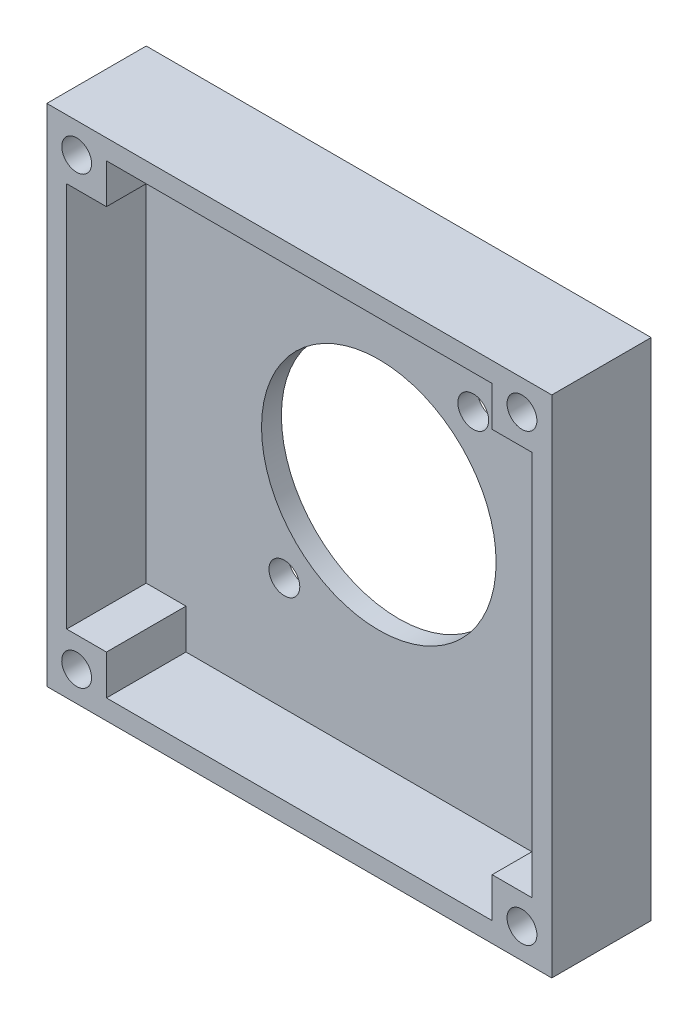
ISO-10303-21;
HEADER;
FILE_DESCRIPTION(('STEP AP214'),'2;1');
FILE_NAME('part.step','',(''),(''),'','','');
FILE_SCHEMA(('AUTOMOTIVE_DESIGN { 1 0 10303 214 1 1 1 1 }'));
ENDSEC;
DATA;
#1=APPLICATION_CONTEXT('core data for automotive mechanical design processes');
#2=APPLICATION_PROTOCOL_DEFINITION('international standard','automotive_design',2000,#1);
#3=PRODUCT_CONTEXT('',#1,'mechanical');
#4=PRODUCT('Part','Part','',(#3));
#5=PRODUCT_RELATED_PRODUCT_CATEGORY('part','',(#4));
#6=PRODUCT_DEFINITION_FORMATION('','',#4);
#7=PRODUCT_DEFINITION_CONTEXT('part definition',#1,'design');
#8=PRODUCT_DEFINITION('design','',#6,#7);
#9=PRODUCT_DEFINITION_SHAPE('','',#8);
#10=(LENGTH_UNIT() NAMED_UNIT(*) SI_UNIT(.MILLI.,.METRE.));
#11=(NAMED_UNIT(*) PLANE_ANGLE_UNIT() SI_UNIT($,.RADIAN.));
#12=(NAMED_UNIT(*) SI_UNIT($,.STERADIAN.) SOLID_ANGLE_UNIT());
#13=UNCERTAINTY_MEASURE_WITH_UNIT(LENGTH_MEASURE(1.E-05),#10,'distance_accuracy_value','');
#14=(GEOMETRIC_REPRESENTATION_CONTEXT(3) GLOBAL_UNCERTAINTY_ASSIGNED_CONTEXT((#13)) GLOBAL_UNIT_ASSIGNED_CONTEXT((#10,
#11,#12)) REPRESENTATION_CONTEXT('',''));
#15=CARTESIAN_POINT('',(0.,0.,0.));
#16=DIRECTION('',(0.,0.,1.));
#17=DIRECTION('',(1.,0.,0.));
#18=AXIS2_PLACEMENT_3D('',#15,#16,#17);
#19=CARTESIAN_POINT('',(0.,0.,2.));
#20=DIRECTION('',(0.,0.,-1.));
#21=DIRECTION('',(-1.,0.,0.));
#22=AXIS2_PLACEMENT_3D('',#19,#20,#21);
#23=PLANE('',#22);
#24=DIRECTION('',(1.,0.,0.));
#25=VECTOR('',#24,1.);
#26=CARTESIAN_POINT('',(0.,23.4,2.));
#27=LINE('',#26,#25);
#28=CARTESIAN_POINT('',(-19.4,23.4,2.));
#29=VERTEX_POINT('',#28);
#30=CARTESIAN_POINT('',(19.4,23.4,2.));
#31=VERTEX_POINT('',#30);
#32=EDGE_CURVE('E668',#29,#31,#27,.T.);
#33=ORIENTED_EDGE('',*,*,#32,.F.);
#34=DIRECTION('',(0.,-1.,0.));
#35=VECTOR('',#34,1.);
#36=CARTESIAN_POINT('',(-19.4,0.,2.));
#37=LINE('',#36,#35);
#38=CARTESIAN_POINT('',(-19.4,19.4,2.));
#39=VERTEX_POINT('',#38);
#40=EDGE_CURVE('E671',#29,#39,#37,.T.);
#41=ORIENTED_EDGE('',*,*,#40,.T.);
#42=DIRECTION('',(1.,0.,0.));
#43=VECTOR('',#42,1.);
#44=CARTESIAN_POINT('',(0.,19.4,2.));
#45=LINE('',#44,#43);
#46=CARTESIAN_POINT('',(-23.4,19.4,2.));
#47=VERTEX_POINT('',#46);
#48=EDGE_CURVE('E639',#47,#39,#45,.T.);
#49=ORIENTED_EDGE('',*,*,#48,.F.);
#50=DIRECTION('',(0.,1.,0.));
#51=VECTOR('',#50,1.);
#52=CARTESIAN_POINT('',(-23.4,0.,2.));
#53=LINE('',#52,#51);
#54=CARTESIAN_POINT('',(-23.4,-19.4,2.));
#55=VERTEX_POINT('',#54);
#56=EDGE_CURVE('E646',#55,#47,#53,.T.);
#57=ORIENTED_EDGE('',*,*,#56,.F.);
#58=DIRECTION('',(1.,0.,0.));
#59=VECTOR('',#58,1.);
#60=CARTESIAN_POINT('',(0.,-19.4,2.));
#61=LINE('',#60,#59);
#62=CARTESIAN_POINT('',(-19.4,-19.4,2.));
#63=VERTEX_POINT('',#62);
#64=EDGE_CURVE('E649',#55,#63,#61,.T.);
#65=ORIENTED_EDGE('',*,*,#64,.T.);
#66=DIRECTION('',(0.,1.,0.));
#67=VECTOR('',#66,1.);
#68=CARTESIAN_POINT('',(-19.4,0.,2.));
#69=LINE('',#68,#67);
#70=CARTESIAN_POINT('',(-19.4,-23.4,2.));
#71=VERTEX_POINT('',#70);
#72=EDGE_CURVE('E651',#71,#63,#69,.T.);
#73=ORIENTED_EDGE('',*,*,#72,.F.);
#74=DIRECTION('',(1.,0.,0.));
#75=VECTOR('',#74,1.);
#76=CARTESIAN_POINT('',(0.,-23.4,2.));
#77=LINE('',#76,#75);
#78=CARTESIAN_POINT('',(19.4,-23.4,2.));
#79=VERTEX_POINT('',#78);
#80=EDGE_CURVE('E654',#71,#79,#77,.T.);
#81=ORIENTED_EDGE('',*,*,#80,.T.);
#82=DIRECTION('',(0.,1.,0.));
#83=VECTOR('',#82,1.);
#84=CARTESIAN_POINT('',(19.4,0.,2.));
#85=LINE('',#84,#83);
#86=CARTESIAN_POINT('',(19.4,-19.4,2.));
#87=VERTEX_POINT('',#86);
#88=EDGE_CURVE('E656',#79,#87,#85,.T.);
#89=ORIENTED_EDGE('',*,*,#88,.T.);
#90=DIRECTION('',(-1.,0.,0.));
#91=VECTOR('',#90,1.);
#92=CARTESIAN_POINT('',(0.,-19.4,2.));
#93=LINE('',#92,#91);
#94=CARTESIAN_POINT('',(23.4,-19.4,2.));
#95=VERTEX_POINT('',#94);
#96=EDGE_CURVE('E658',#95,#87,#93,.T.);
#97=ORIENTED_EDGE('',*,*,#96,.F.);
#98=DIRECTION('',(0.,1.,0.));
#99=VECTOR('',#98,1.);
#100=CARTESIAN_POINT('',(23.4,0.,2.));
#101=LINE('',#100,#99);
#102=CARTESIAN_POINT('',(23.4,19.4,2.));
#103=VERTEX_POINT('',#102);
#104=EDGE_CURVE('E661',#95,#103,#101,.T.);
#105=ORIENTED_EDGE('',*,*,#104,.T.);
#106=DIRECTION('',(-1.,0.,0.));
#107=VECTOR('',#106,1.);
#108=CARTESIAN_POINT('',(0.,19.4,2.));
#109=LINE('',#108,#107);
#110=CARTESIAN_POINT('',(19.4,19.4,2.));
#111=VERTEX_POINT('',#110);
#112=EDGE_CURVE('E663',#103,#111,#109,.T.);
#113=ORIENTED_EDGE('',*,*,#112,.T.);
#114=DIRECTION('',(0.,-1.,0.));
#115=VECTOR('',#114,1.);
#116=CARTESIAN_POINT('',(19.4,0.,2.));
#117=LINE('',#116,#115);
#118=EDGE_CURVE('E665',#31,#111,#117,.T.);
#119=ORIENTED_EDGE('',*,*,#118,.F.);
#120=EDGE_LOOP('',(#33,#41,#49,#57,#65,#73,#81,#89,#97,#105,#113,#119));
#121=FACE_BOUND('',#120,.T.);
#122=CARTESIAN_POINT('',(0.,0.,2.));
#123=DIRECTION('',(0.,0.,1.));
#124=DIRECTION('',(1.,0.,0.));
#125=AXIS2_PLACEMENT_3D('',#122,#123,#124);
#126=CIRCLE('',#125,11.8);
#127=CARTESIAN_POINT('',(11.8,0.,2.));
#128=VERTEX_POINT('',#127);
#129=EDGE_CURVE('E557',#128,#128,#126,.T.);
#130=ORIENTED_EDGE('',*,*,#129,.F.);
#131=EDGE_LOOP('',(#130));
#132=FACE_BOUND('',#131,.T.);
#133=CARTESIAN_POINT('',(-9.5,-12.,2.));
#134=DIRECTION('',(0.,0.,1.));
#135=DIRECTION('',(1.,0.,0.));
#136=AXIS2_PLACEMENT_3D('',#133,#134,#135);
#137=CIRCLE('',#136,1.55);
#138=CARTESIAN_POINT('',(-7.94999999999999,-12.,2.));
#139=VERTEX_POINT('',#138);
#140=EDGE_CURVE('E680',#139,#139,#137,.T.);
#141=ORIENTED_EDGE('',*,*,#140,.F.);
#142=EDGE_LOOP('',(#141));
#143=FACE_BOUND('',#142,.T.);
#144=CARTESIAN_POINT('',(9.5,12.,2.));
#145=DIRECTION('',(0.,0.,1.));
#146=DIRECTION('',(1.,0.,0.));
#147=AXIS2_PLACEMENT_3D('',#144,#145,#146);
#148=CIRCLE('',#147,1.55);
#149=CARTESIAN_POINT('',(11.05,12.,2.));
#150=VERTEX_POINT('',#149);
#151=EDGE_CURVE('E674',#150,#150,#148,.T.);
#152=ORIENTED_EDGE('',*,*,#151,.F.);
#153=EDGE_LOOP('',(#152));
#154=FACE_BOUND('',#153,.T.);
#155=ADVANCED_FACE('F34',(#121,#132,#143,#154),#23,.F.);
#156=CARTESIAN_POINT('',(0.,0.,0.));
#157=DIRECTION('',(0.,0.,-1.));
#158=DIRECTION('',(-1.,0.,0.));
#159=AXIS2_PLACEMENT_3D('',#156,#157,#158);
#160=PLANE('',#159);
#161=CARTESIAN_POINT('',(-22.4,-22.5292564643802,0.));
#162=DIRECTION('',(0.,0.,1.));
#163=DIRECTION('',(-1.,0.,0.));
#164=AXIS2_PLACEMENT_3D('',#161,#162,#163);
#165=CIRCLE('',#164,1.5);
#166=CARTESIAN_POINT('',(-23.9,-22.5292564643802,0.));
#167=VERTEX_POINT('',#166);
#168=EDGE_CURVE('E162',#167,#167,#165,.T.);
#169=ORIENTED_EDGE('',*,*,#168,.T.);
#170=EDGE_LOOP('',(#169));
#171=FACE_BOUND('',#170,.T.);
#172=CARTESIAN_POINT('',(22.4,-22.5292564643802,0.));
#173=DIRECTION('',(0.,0.,1.));
#174=DIRECTION('',(1.,0.,0.));
#175=AXIS2_PLACEMENT_3D('',#172,#173,#174);
#176=CIRCLE('',#175,1.5);
#177=CARTESIAN_POINT('',(23.9,-22.5292564643802,0.));
#178=VERTEX_POINT('',#177);
#179=EDGE_CURVE('E168',#178,#178,#176,.T.);
#180=ORIENTED_EDGE('',*,*,#179,.T.);
#181=EDGE_LOOP('',(#180));
#182=FACE_BOUND('',#181,.T.);
#183=CARTESIAN_POINT('',(22.4,22.4,0.));
#184=DIRECTION('',(0.,0.,1.));
#185=DIRECTION('',(-1.,0.,0.));
#186=AXIS2_PLACEMENT_3D('',#183,#184,#185);
#187=CIRCLE('',#186,1.5);
#188=CARTESIAN_POINT('',(20.9,22.4,0.));
#189=VERTEX_POINT('',#188);
#190=EDGE_CURVE('E712',#189,#189,#187,.T.);
#191=ORIENTED_EDGE('',*,*,#190,.T.);
#192=EDGE_LOOP('',(#191));
#193=FACE_BOUND('',#192,.T.);
#194=CARTESIAN_POINT('',(-22.4,22.4,0.));
#195=DIRECTION('',(0.,0.,1.));
#196=DIRECTION('',(1.,0.,0.));
#197=AXIS2_PLACEMENT_3D('',#194,#195,#196);
#198=CIRCLE('',#197,1.5);
#199=CARTESIAN_POINT('',(-20.9,22.4,0.));
#200=VERTEX_POINT('',#199);
#201=EDGE_CURVE('E707',#200,#200,#198,.T.);
#202=ORIENTED_EDGE('',*,*,#201,.T.);
#203=EDGE_LOOP('',(#202));
#204=FACE_BOUND('',#203,.T.);
#205=CARTESIAN_POINT('',(-9.5,-12.,0.));
#206=DIRECTION('',(0.,0.,1.));
#207=DIRECTION('',(1.,0.,0.));
#208=AXIS2_PLACEMENT_3D('',#205,#206,#207);
#209=CIRCLE('',#208,1.55);
#210=CARTESIAN_POINT('',(-7.94999999999999,-12.,0.));
#211=VERTEX_POINT('',#210);
#212=EDGE_CURVE('E677',#211,#211,#209,.T.);
#213=ORIENTED_EDGE('',*,*,#212,.T.);
#214=EDGE_LOOP('',(#213));
#215=FACE_BOUND('',#214,.T.);
#216=CARTESIAN_POINT('',(0.,0.,0.));
#217=DIRECTION('',(0.,0.,1.));
#218=DIRECTION('',(1.,0.,0.));
#219=AXIS2_PLACEMENT_3D('',#216,#217,#218);
#220=CIRCLE('',#219,11.8);
#221=CARTESIAN_POINT('',(11.8,0.,0.));
#222=VERTEX_POINT('',#221);
#223=EDGE_CURVE('E562',#222,#222,#220,.T.);
#224=ORIENTED_EDGE('',*,*,#223,.T.);
#225=EDGE_LOOP('',(#224));
#226=FACE_BOUND('',#225,.T.);
#227=CARTESIAN_POINT('',(9.5,12.,0.));
#228=DIRECTION('',(0.,0.,1.));
#229=DIRECTION('',(1.,0.,0.));
#230=AXIS2_PLACEMENT_3D('',#227,#228,#229);
#231=CIRCLE('',#230,1.55);
#232=CARTESIAN_POINT('',(11.05,12.,0.));
#233=VERTEX_POINT('',#232);
#234=EDGE_CURVE('E673',#233,#233,#231,.T.);
#235=ORIENTED_EDGE('',*,*,#234,.T.);
#236=EDGE_LOOP('',(#235));
#237=FACE_BOUND('',#236,.T.);
#238=DIRECTION('',(0.,1.,0.));
#239=VECTOR('',#238,1.);
#240=CARTESIAN_POINT('',(25.4,-25.4,0.));
#241=LINE('',#240,#239);
#242=CARTESIAN_POINT('',(25.4,-25.4,0.));
#243=VERTEX_POINT('',#242);
#244=CARTESIAN_POINT('',(25.4,25.4,0.));
#245=VERTEX_POINT('',#244);
#246=EDGE_CURVE('E549',#243,#245,#241,.T.);
#247=ORIENTED_EDGE('',*,*,#246,.F.);
#248=DIRECTION('',(1.,0.,0.));
#249=VECTOR('',#248,1.);
#250=CARTESIAN_POINT('',(-25.4,-25.4,0.));
#251=LINE('',#250,#249);
#252=CARTESIAN_POINT('',(-25.4,-25.4,0.));
#253=VERTEX_POINT('',#252);
#254=EDGE_CURVE('E567',#253,#243,#251,.T.);
#255=ORIENTED_EDGE('',*,*,#254,.F.);
#256=DIRECTION('',(0.,-1.,0.));
#257=VECTOR('',#256,1.);
#258=CARTESIAN_POINT('',(-25.4,-25.4,0.));
#259=LINE('',#258,#257);
#260=CARTESIAN_POINT('',(-25.4,25.4,0.));
#261=VERTEX_POINT('',#260);
#262=EDGE_CURVE('E559',#261,#253,#259,.T.);
#263=ORIENTED_EDGE('',*,*,#262,.F.);
#264=DIRECTION('',(-1.,0.,0.));
#265=VECTOR('',#264,1.);
#266=CARTESIAN_POINT('',(-25.4,25.4,0.));
#267=LINE('',#266,#265);
#268=EDGE_CURVE('E556',#245,#261,#267,.T.);
#269=ORIENTED_EDGE('',*,*,#268,.F.);
#270=EDGE_LOOP('',(#247,#255,#263,#269));
#271=FACE_BOUND('',#270,.T.);
#272=ADVANCED_FACE('F189',(#171,#182,#193,#204,#215,#226,#237,#271),#160,.T.);
#273=CARTESIAN_POINT('',(25.4,-25.4,2.));
#274=DIRECTION('',(-1.,0.,0.));
#275=DIRECTION('',(0.,0.,1.));
#276=AXIS2_PLACEMENT_3D('',#273,#274,#275);
#277=PLANE('',#276);
#278=ORIENTED_EDGE('',*,*,#246,.T.);
#279=DIRECTION('',(0.,0.,-1.));
#280=VECTOR('',#279,1.);
#281=CARTESIAN_POINT('',(25.4,25.4,2.));
#282=LINE('',#281,#280);
#283=CARTESIAN_POINT('',(25.4,25.4,10.));
#284=VERTEX_POINT('',#283);
#285=EDGE_CURVE('E38',#284,#245,#282,.T.);
#286=ORIENTED_EDGE('',*,*,#285,.F.);
#287=DIRECTION('',(0.,1.,0.));
#288=VECTOR('',#287,1.);
#289=CARTESIAN_POINT('',(25.4,0.,10.));
#290=LINE('',#289,#288);
#291=CARTESIAN_POINT('',(25.4,-25.4,10.));
#292=VERTEX_POINT('',#291);
#293=EDGE_CURVE('E593',#292,#284,#290,.T.);
#294=ORIENTED_EDGE('',*,*,#293,.F.);
#295=DIRECTION('',(0.,0.,-1.));
#296=VECTOR('',#295,1.);
#297=CARTESIAN_POINT('',(25.4,-25.4,2.));
#298=LINE('',#297,#296);
#299=EDGE_CURVE('E553',#292,#243,#298,.T.);
#300=ORIENTED_EDGE('',*,*,#299,.T.);
#301=EDGE_LOOP('',(#278,#286,#294,#300));
#302=FACE_BOUND('',#301,.T.);
#303=ADVANCED_FACE('F36',(#302),#277,.F.);
#304=CARTESIAN_POINT('',(-25.4,25.4,2.));
#305=DIRECTION('',(0.,-1.,0.));
#306=DIRECTION('',(0.,0.,-1.));
#307=AXIS2_PLACEMENT_3D('',#304,#305,#306);
#308=PLANE('',#307);
#309=ORIENTED_EDGE('',*,*,#268,.T.);
#310=DIRECTION('',(0.,0.,-1.));
#311=VECTOR('',#310,1.);
#312=CARTESIAN_POINT('',(-25.4,25.4,2.));
#313=LINE('',#312,#311);
#314=CARTESIAN_POINT('',(-25.4,25.4,10.));
#315=VERTEX_POINT('',#314);
#316=EDGE_CURVE('E572',#315,#261,#313,.T.);
#317=ORIENTED_EDGE('',*,*,#316,.F.);
#318=DIRECTION('',(1.,0.,0.));
#319=VECTOR('',#318,1.);
#320=CARTESIAN_POINT('',(0.,25.4,10.));
#321=LINE('',#320,#319);
#322=EDGE_CURVE('E578',#315,#284,#321,.T.);
#323=ORIENTED_EDGE('',*,*,#322,.T.);
#324=ORIENTED_EDGE('',*,*,#285,.T.);
#325=EDGE_LOOP('',(#309,#317,#323,#324));
#326=FACE_BOUND('',#325,.T.);
#327=ADVANCED_FACE('F429',(#326),#308,.F.);
#328=CARTESIAN_POINT('',(-25.4,-25.4,2.));
#329=DIRECTION('',(1.,0.,0.));
#330=DIRECTION('',(0.,0.,-1.));
#331=AXIS2_PLACEMENT_3D('',#328,#329,#330);
#332=PLANE('',#331);
#333=ORIENTED_EDGE('',*,*,#262,.T.);
#334=DIRECTION('',(0.,0.,-1.));
#335=VECTOR('',#334,1.);
#336=CARTESIAN_POINT('',(-25.4,-25.4,2.));
#337=LINE('',#336,#335);
#338=CARTESIAN_POINT('',(-25.4,-25.4,10.));
#339=VERTEX_POINT('',#338);
#340=EDGE_CURVE('E570',#339,#253,#337,.T.);
#341=ORIENTED_EDGE('',*,*,#340,.F.);
#342=DIRECTION('',(0.,1.,0.));
#343=VECTOR('',#342,1.);
#344=CARTESIAN_POINT('',(-25.4,0.,10.));
#345=LINE('',#344,#343);
#346=EDGE_CURVE('E581',#339,#315,#345,.T.);
#347=ORIENTED_EDGE('',*,*,#346,.T.);
#348=ORIENTED_EDGE('',*,*,#316,.T.);
#349=EDGE_LOOP('',(#333,#341,#347,#348));
#350=FACE_BOUND('',#349,.T.);
#351=ADVANCED_FACE('F421',(#350),#332,.F.);
#352=CARTESIAN_POINT('',(-25.4,-25.4,2.));
#353=DIRECTION('',(0.,1.,0.));
#354=DIRECTION('',(0.,0.,1.));
#355=AXIS2_PLACEMENT_3D('',#352,#353,#354);
#356=PLANE('',#355);
#357=ORIENTED_EDGE('',*,*,#254,.T.);
#358=ORIENTED_EDGE('',*,*,#299,.F.);
#359=DIRECTION('',(1.,0.,0.));
#360=VECTOR('',#359,1.);
#361=CARTESIAN_POINT('',(0.,-25.4,10.));
#362=LINE('',#361,#360);
#363=EDGE_CURVE('E584',#339,#292,#362,.T.);
#364=ORIENTED_EDGE('',*,*,#363,.F.);
#365=ORIENTED_EDGE('',*,*,#340,.T.);
#366=EDGE_LOOP('',(#357,#358,#364,#365));
#367=FACE_BOUND('',#366,.T.);
#368=ADVANCED_FACE('F415',(#367),#356,.F.);
#369=CARTESIAN_POINT('',(0.,0.,2.));
#370=DIRECTION('',(0.,0.,-1.));
#371=DIRECTION('',(-1.,0.,0.));
#372=AXIS2_PLACEMENT_3D('',#369,#370,#371);
#373=CYLINDRICAL_SURFACE('',#372,11.8);
#374=ORIENTED_EDGE('',*,*,#129,.T.);
#375=EDGE_LOOP('',(#374));
#376=FACE_BOUND('',#375,.T.);
#377=ORIENTED_EDGE('',*,*,#223,.F.);
#378=EDGE_LOOP('',(#377));
#379=FACE_BOUND('',#378,.T.);
#380=ADVANCED_FACE('F407',(#376,#379),#373,.F.);
#381=CARTESIAN_POINT('',(-9.5,-12.,2.));
#382=DIRECTION('',(0.,0.,-1.));
#383=DIRECTION('',(-1.,0.,0.));
#384=AXIS2_PLACEMENT_3D('',#381,#382,#383);
#385=CYLINDRICAL_SURFACE('',#384,1.55);
#386=ORIENTED_EDGE('',*,*,#140,.T.);
#387=EDGE_LOOP('',(#386));
#388=FACE_BOUND('',#387,.T.);
#389=ORIENTED_EDGE('',*,*,#212,.F.);
#390=EDGE_LOOP('',(#389));
#391=FACE_BOUND('',#390,.T.);
#392=ADVANCED_FACE('F399',(#388,#391),#385,.F.);
#393=CARTESIAN_POINT('',(9.5,12.,2.));
#394=DIRECTION('',(0.,0.,-1.));
#395=DIRECTION('',(-1.,0.,0.));
#396=AXIS2_PLACEMENT_3D('',#393,#394,#395);
#397=CYLINDRICAL_SURFACE('',#396,1.55);
#398=ORIENTED_EDGE('',*,*,#151,.T.);
#399=EDGE_LOOP('',(#398));
#400=FACE_BOUND('',#399,.T.);
#401=ORIENTED_EDGE('',*,*,#234,.F.);
#402=EDGE_LOOP('',(#401));
#403=FACE_BOUND('',#402,.T.);
#404=ADVANCED_FACE('F390',(#400,#403),#397,.F.);
#405=CARTESIAN_POINT('',(-19.4,0.,10.));
#406=DIRECTION('',(1.,0.,0.));
#407=DIRECTION('',(0.,0.,-1.));
#408=AXIS2_PLACEMENT_3D('',#405,#406,#407);
#409=PLANE('',#408);
#410=ORIENTED_EDGE('',*,*,#40,.F.);
#411=DIRECTION('',(0.,0.,-1.));
#412=VECTOR('',#411,1.);
#413=CARTESIAN_POINT('',(-19.4,23.4,10.));
#414=LINE('',#413,#412);
#415=CARTESIAN_POINT('',(-19.4,23.4,10.));
#416=VERTEX_POINT('',#415);
#417=EDGE_CURVE('E637',#416,#29,#414,.T.);
#418=ORIENTED_EDGE('',*,*,#417,.F.);
#419=DIRECTION('',(0.,-1.,0.));
#420=VECTOR('',#419,1.);
#421=CARTESIAN_POINT('',(-19.4,0.,10.));
#422=LINE('',#421,#420);
#423=CARTESIAN_POINT('',(-19.4,19.4,10.));
#424=VERTEX_POINT('',#423);
#425=EDGE_CURVE('E704',#416,#424,#422,.T.);
#426=ORIENTED_EDGE('',*,*,#425,.T.);
#427=DIRECTION('',(0.,0.,-1.));
#428=VECTOR('',#427,1.);
#429=CARTESIAN_POINT('',(-19.4,19.4,10.));
#430=LINE('',#429,#428);
#431=EDGE_CURVE('E604',#424,#39,#430,.T.);
#432=ORIENTED_EDGE('',*,*,#431,.T.);
#433=EDGE_LOOP('',(#410,#418,#426,#432));
#434=FACE_BOUND('',#433,.T.);
#435=ADVANCED_FACE('F382',(#434),#409,.T.);
#436=CARTESIAN_POINT('',(0.,23.4,10.));
#437=DIRECTION('',(0.,1.,0.));
#438=DIRECTION('',(0.,0.,1.));
#439=AXIS2_PLACEMENT_3D('',#436,#437,#438);
#440=PLANE('',#439);
#441=ORIENTED_EDGE('',*,*,#417,.T.);
#442=ORIENTED_EDGE('',*,*,#32,.T.);
#443=DIRECTION('',(0.,0.,-1.));
#444=VECTOR('',#443,1.);
#445=CARTESIAN_POINT('',(19.4,23.4,10.));
#446=LINE('',#445,#444);
#447=CARTESIAN_POINT('',(19.4,23.4,10.));
#448=VERTEX_POINT('',#447);
#449=EDGE_CURVE('E634',#448,#31,#446,.T.);
#450=ORIENTED_EDGE('',*,*,#449,.F.);
#451=DIRECTION('',(1.,0.,0.));
#452=VECTOR('',#451,1.);
#453=CARTESIAN_POINT('',(0.,23.4,10.));
#454=LINE('',#453,#452);
#455=EDGE_CURVE('E706',#416,#448,#454,.T.);
#456=ORIENTED_EDGE('',*,*,#455,.F.);
#457=EDGE_LOOP('',(#441,#442,#450,#456));
#458=FACE_BOUND('',#457,.T.);
#459=ADVANCED_FACE('F374',(#458),#440,.F.);
#460=CARTESIAN_POINT('',(19.4,0.,10.));
#461=DIRECTION('',(1.,0.,0.));
#462=DIRECTION('',(0.,0.,-1.));
#463=AXIS2_PLACEMENT_3D('',#460,#461,#462);
#464=PLANE('',#463);
#465=ORIENTED_EDGE('',*,*,#449,.T.);
#466=ORIENTED_EDGE('',*,*,#118,.T.);
#467=DIRECTION('',(0.,0.,-1.));
#468=VECTOR('',#467,1.);
#469=CARTESIAN_POINT('',(19.4,19.4,10.));
#470=LINE('',#469,#468);
#471=CARTESIAN_POINT('',(19.4,19.4,10.));
#472=VERTEX_POINT('',#471);
#473=EDGE_CURVE('E631',#472,#111,#470,.T.);
#474=ORIENTED_EDGE('',*,*,#473,.F.);
#475=DIRECTION('',(0.,-1.,0.));
#476=VECTOR('',#475,1.);
#477=CARTESIAN_POINT('',(19.4,0.,10.));
#478=LINE('',#477,#476);
#479=EDGE_CURVE('E709',#448,#472,#478,.T.);
#480=ORIENTED_EDGE('',*,*,#479,.F.);
#481=EDGE_LOOP('',(#465,#466,#474,#480));
#482=FACE_BOUND('',#481,.T.);
#483=ADVANCED_FACE('F366',(#482),#464,.F.);
#484=CARTESIAN_POINT('',(0.,19.4,10.));
#485=DIRECTION('',(0.,-1.,0.));
#486=DIRECTION('',(0.,0.,-1.));
#487=AXIS2_PLACEMENT_3D('',#484,#485,#486);
#488=PLANE('',#487);
#489=ORIENTED_EDGE('',*,*,#112,.F.);
#490=DIRECTION('',(0.,0.,-1.));
#491=VECTOR('',#490,1.);
#492=CARTESIAN_POINT('',(23.4,19.4,10.));
#493=LINE('',#492,#491);
#494=CARTESIAN_POINT('',(23.4,19.4,10.));
#495=VERTEX_POINT('',#494);
#496=EDGE_CURVE('E628',#495,#103,#493,.T.);
#497=ORIENTED_EDGE('',*,*,#496,.F.);
#498=DIRECTION('',(-1.,0.,0.));
#499=VECTOR('',#498,1.);
#500=CARTESIAN_POINT('',(0.,19.4,10.));
#501=LINE('',#500,#499);
#502=EDGE_CURVE('E717',#495,#472,#501,.T.);
#503=ORIENTED_EDGE('',*,*,#502,.T.);
#504=ORIENTED_EDGE('',*,*,#473,.T.);
#505=EDGE_LOOP('',(#489,#497,#503,#504));
#506=FACE_BOUND('',#505,.T.);
#507=ADVANCED_FACE('F358',(#506),#488,.T.);
#508=CARTESIAN_POINT('',(23.4,0.,10.));
#509=DIRECTION('',(-1.,0.,0.));
#510=DIRECTION('',(0.,0.,1.));
#511=AXIS2_PLACEMENT_3D('',#508,#509,#510);
#512=PLANE('',#511);
#513=ORIENTED_EDGE('',*,*,#104,.F.);
#514=DIRECTION('',(0.,0.,-1.));
#515=VECTOR('',#514,1.);
#516=CARTESIAN_POINT('',(23.4,-19.4,10.));
#517=LINE('',#516,#515);
#518=CARTESIAN_POINT('',(23.4,-19.4,10.));
#519=VERTEX_POINT('',#518);
#520=EDGE_CURVE('E625',#519,#95,#517,.T.);
#521=ORIENTED_EDGE('',*,*,#520,.F.);
#522=DIRECTION('',(0.,1.,0.));
#523=VECTOR('',#522,1.);
#524=CARTESIAN_POINT('',(23.4,0.,10.));
#525=LINE('',#524,#523);
#526=EDGE_CURVE('E720',#519,#495,#525,.T.);
#527=ORIENTED_EDGE('',*,*,#526,.T.);
#528=ORIENTED_EDGE('',*,*,#496,.T.);
#529=EDGE_LOOP('',(#513,#521,#527,#528));
#530=FACE_BOUND('',#529,.T.);
#531=ADVANCED_FACE('F350',(#530),#512,.T.);
#532=CARTESIAN_POINT('',(0.,-19.4,10.));
#533=DIRECTION('',(0.,-1.,0.));
#534=DIRECTION('',(0.,0.,-1.));
#535=AXIS2_PLACEMENT_3D('',#532,#533,#534);
#536=PLANE('',#535);
#537=ORIENTED_EDGE('',*,*,#520,.T.);
#538=ORIENTED_EDGE('',*,*,#96,.T.);
#539=DIRECTION('',(0.,0.,-1.));
#540=VECTOR('',#539,1.);
#541=CARTESIAN_POINT('',(19.4,-19.4,10.));
#542=LINE('',#541,#540);
#543=CARTESIAN_POINT('',(19.4,-19.4,10.));
#544=VERTEX_POINT('',#543);
#545=EDGE_CURVE('E622',#544,#87,#542,.T.);
#546=ORIENTED_EDGE('',*,*,#545,.F.);
#547=DIRECTION('',(-1.,0.,0.));
#548=VECTOR('',#547,1.);
#549=CARTESIAN_POINT('',(0.,-19.4,10.));
#550=LINE('',#549,#548);
#551=EDGE_CURVE('E723',#519,#544,#550,.T.);
#552=ORIENTED_EDGE('',*,*,#551,.F.);
#553=EDGE_LOOP('',(#537,#538,#546,#552));
#554=FACE_BOUND('',#553,.T.);
#555=ADVANCED_FACE('F342',(#554),#536,.F.);
#556=CARTESIAN_POINT('',(19.4,0.,10.));
#557=DIRECTION('',(-1.,0.,0.));
#558=DIRECTION('',(0.,0.,1.));
#559=AXIS2_PLACEMENT_3D('',#556,#557,#558);
#560=PLANE('',#559);
#561=ORIENTED_EDGE('',*,*,#88,.F.);
#562=DIRECTION('',(0.,0.,-1.));
#563=VECTOR('',#562,1.);
#564=CARTESIAN_POINT('',(19.4,-23.4,10.));
#565=LINE('',#564,#563);
#566=CARTESIAN_POINT('',(19.4,-23.4,10.));
#567=VERTEX_POINT('',#566);
#568=EDGE_CURVE('E619',#567,#79,#565,.T.);
#569=ORIENTED_EDGE('',*,*,#568,.F.);
#570=DIRECTION('',(0.,1.,0.));
#571=VECTOR('',#570,1.);
#572=CARTESIAN_POINT('',(19.4,0.,10.));
#573=LINE('',#572,#571);
#574=EDGE_CURVE('E725',#567,#544,#573,.T.);
#575=ORIENTED_EDGE('',*,*,#574,.T.);
#576=ORIENTED_EDGE('',*,*,#545,.T.);
#577=EDGE_LOOP('',(#561,#569,#575,#576));
#578=FACE_BOUND('',#577,.T.);
#579=ADVANCED_FACE('F334',(#578),#560,.T.);
#580=CARTESIAN_POINT('',(0.,-23.4,10.));
#581=DIRECTION('',(0.,1.,0.));
#582=DIRECTION('',(0.,0.,1.));
#583=AXIS2_PLACEMENT_3D('',#580,#581,#582);
#584=PLANE('',#583);
#585=ORIENTED_EDGE('',*,*,#80,.F.);
#586=DIRECTION('',(0.,0.,-1.));
#587=VECTOR('',#586,1.);
#588=CARTESIAN_POINT('',(-19.4,-23.4,10.));
#589=LINE('',#588,#587);
#590=CARTESIAN_POINT('',(-19.4,-23.4,10.));
#591=VERTEX_POINT('',#590);
#592=EDGE_CURVE('E616',#591,#71,#589,.T.);
#593=ORIENTED_EDGE('',*,*,#592,.F.);
#594=DIRECTION('',(1.,0.,0.));
#595=VECTOR('',#594,1.);
#596=CARTESIAN_POINT('',(0.,-23.4,10.));
#597=LINE('',#596,#595);
#598=EDGE_CURVE('E728',#591,#567,#597,.T.);
#599=ORIENTED_EDGE('',*,*,#598,.T.);
#600=ORIENTED_EDGE('',*,*,#568,.T.);
#601=EDGE_LOOP('',(#585,#593,#599,#600));
#602=FACE_BOUND('',#601,.T.);
#603=ADVANCED_FACE('F326',(#602),#584,.T.);
#604=CARTESIAN_POINT('',(-19.4,0.,10.));
#605=DIRECTION('',(-1.,0.,0.));
#606=DIRECTION('',(0.,0.,1.));
#607=AXIS2_PLACEMENT_3D('',#604,#605,#606);
#608=PLANE('',#607);
#609=ORIENTED_EDGE('',*,*,#592,.T.);
#610=ORIENTED_EDGE('',*,*,#72,.T.);
#611=DIRECTION('',(0.,0.,-1.));
#612=VECTOR('',#611,1.);
#613=CARTESIAN_POINT('',(-19.4,-19.4,10.));
#614=LINE('',#613,#612);
#615=CARTESIAN_POINT('',(-19.4,-19.4,10.));
#616=VERTEX_POINT('',#615);
#617=EDGE_CURVE('E613',#616,#63,#614,.T.);
#618=ORIENTED_EDGE('',*,*,#617,.F.);
#619=DIRECTION('',(0.,1.,0.));
#620=VECTOR('',#619,1.);
#621=CARTESIAN_POINT('',(-19.4,0.,10.));
#622=LINE('',#621,#620);
#623=EDGE_CURVE('E731',#591,#616,#622,.T.);
#624=ORIENTED_EDGE('',*,*,#623,.F.);
#625=EDGE_LOOP('',(#609,#610,#618,#624));
#626=FACE_BOUND('',#625,.T.);
#627=ADVANCED_FACE('F318',(#626),#608,.F.);
#628=CARTESIAN_POINT('',(0.,-19.4,10.));
#629=DIRECTION('',(0.,1.,0.));
#630=DIRECTION('',(0.,0.,1.));
#631=AXIS2_PLACEMENT_3D('',#628,#629,#630);
#632=PLANE('',#631);
#633=ORIENTED_EDGE('',*,*,#64,.F.);
#634=DIRECTION('',(0.,0.,-1.));
#635=VECTOR('',#634,1.);
#636=CARTESIAN_POINT('',(-23.4,-19.4,10.));
#637=LINE('',#636,#635);
#638=CARTESIAN_POINT('',(-23.4,-19.4,10.));
#639=VERTEX_POINT('',#638);
#640=EDGE_CURVE('E610',#639,#55,#637,.T.);
#641=ORIENTED_EDGE('',*,*,#640,.F.);
#642=DIRECTION('',(1.,0.,0.));
#643=VECTOR('',#642,1.);
#644=CARTESIAN_POINT('',(0.,-19.4,10.));
#645=LINE('',#644,#643);
#646=EDGE_CURVE('E733',#639,#616,#645,.T.);
#647=ORIENTED_EDGE('',*,*,#646,.T.);
#648=ORIENTED_EDGE('',*,*,#617,.T.);
#649=EDGE_LOOP('',(#633,#641,#647,#648));
#650=FACE_BOUND('',#649,.T.);
#651=ADVANCED_FACE('F311',(#650),#632,.T.);
#652=CARTESIAN_POINT('',(-23.4,0.,10.));
#653=DIRECTION('',(-1.,0.,0.));
#654=DIRECTION('',(0.,0.,1.));
#655=AXIS2_PLACEMENT_3D('',#652,#653,#654);
#656=PLANE('',#655);
#657=ORIENTED_EDGE('',*,*,#640,.T.);
#658=ORIENTED_EDGE('',*,*,#56,.T.);
#659=DIRECTION('',(0.,0.,-1.));
#660=VECTOR('',#659,1.);
#661=CARTESIAN_POINT('',(-23.4,19.4,10.));
#662=LINE('',#661,#660);
#663=CARTESIAN_POINT('',(-23.4,19.4,10.));
#664=VERTEX_POINT('',#663);
#665=EDGE_CURVE('E607',#664,#47,#662,.T.);
#666=ORIENTED_EDGE('',*,*,#665,.F.);
#667=DIRECTION('',(0.,1.,0.));
#668=VECTOR('',#667,1.);
#669=CARTESIAN_POINT('',(-23.4,0.,10.));
#670=LINE('',#669,#668);
#671=EDGE_CURVE('E736',#639,#664,#670,.T.);
#672=ORIENTED_EDGE('',*,*,#671,.F.);
#673=EDGE_LOOP('',(#657,#658,#666,#672));
#674=FACE_BOUND('',#673,.T.);
#675=ADVANCED_FACE('F299',(#674),#656,.F.);
#676=CARTESIAN_POINT('',(-22.4,-22.4,10.));
#677=DIRECTION('',(0.,0.,-1.));
#678=DIRECTION('',(-1.,0.,0.));
#679=AXIS2_PLACEMENT_3D('',#676,#677,#678);
#680=CYLINDRICAL_SURFACE('',#679,1.5);
#681=CARTESIAN_POINT('',(-22.4,-22.4,10.));
#682=DIRECTION('',(0.,0.,1.));
#683=DIRECTION('',(1.,0.,0.));
#684=AXIS2_PLACEMENT_3D('',#681,#682,#683);
#685=CIRCLE('',#684,1.5);
#686=CARTESIAN_POINT('',(-20.9,-22.4,10.));
#687=VERTEX_POINT('',#686);
#688=EDGE_CURVE('E598',#687,#687,#685,.T.);
#689=ORIENTED_EDGE('',*,*,#688,.T.);
#690=EDGE_LOOP('',(#689));
#691=FACE_BOUND('',#690,.T.);
#692=CARTESIAN_POINT('',(-22.4,-22.4,2.));
#693=DIRECTION('',(0.,0.,-1.));
#694=DIRECTION('',(-1.,0.,0.));
#695=AXIS2_PLACEMENT_3D('',#692,#693,#694);
#696=CIRCLE('',#695,1.5);
#697=CARTESIAN_POINT('',(-23.8986070837962,-22.4646282321901,2.));
#698=VERTEX_POINT('',#697);
#699=CARTESIAN_POINT('',(-20.9013929162039,-22.4646282321901,2.));
#700=VERTEX_POINT('',#699);
#701=EDGE_CURVE('E644',#698,#700,#696,.F.);
#702=ORIENTED_EDGE('',*,*,#701,.F.);
#703=EDGE_CURVE('E643',#700,#698,#696,.F.);
#704=ORIENTED_EDGE('',*,*,#703,.F.);
#705=EDGE_LOOP('',(#702,#704));
#706=FACE_BOUND('',#705,.T.);
#707=ADVANCED_FACE('F270',(#691,#706),#680,.F.);
#708=CARTESIAN_POINT('',(22.4,22.4,10.));
#709=DIRECTION('',(0.,0.,-1.));
#710=DIRECTION('',(-1.,0.,0.));
#711=AXIS2_PLACEMENT_3D('',#708,#709,#710);
#712=CYLINDRICAL_SURFACE('',#711,1.5);
#713=CARTESIAN_POINT('',(22.4,22.4,10.));
#714=DIRECTION('',(0.,0.,1.));
#715=DIRECTION('',(1.,0.,0.));
#716=AXIS2_PLACEMENT_3D('',#713,#714,#715);
#717=CIRCLE('',#716,1.5);
#718=CARTESIAN_POINT('',(23.9,22.4,10.));
#719=VERTEX_POINT('',#718);
#720=EDGE_CURVE('E595',#719,#719,#717,.F.);
#721=ORIENTED_EDGE('',*,*,#720,.F.);
#722=EDGE_LOOP('',(#721));
#723=FACE_BOUND('',#722,.T.);
#724=ORIENTED_EDGE('',*,*,#190,.F.);
#725=EDGE_LOOP('',(#724));
#726=FACE_BOUND('',#725,.T.);
#727=ADVANCED_FACE('F257',(#723,#726),#712,.F.);
#728=CARTESIAN_POINT('',(-22.4,22.4,10.));
#729=DIRECTION('',(0.,0.,-1.));
#730=DIRECTION('',(-1.,0.,0.));
#731=AXIS2_PLACEMENT_3D('',#728,#729,#730);
#732=CYLINDRICAL_SURFACE('',#731,1.5);
#733=CARTESIAN_POINT('',(-22.4,22.4,10.));
#734=DIRECTION('',(0.,0.,1.));
#735=DIRECTION('',(1.,0.,0.));
#736=AXIS2_PLACEMENT_3D('',#733,#734,#735);
#737=CIRCLE('',#736,1.5);
#738=CARTESIAN_POINT('',(-20.9,22.4,10.));
#739=VERTEX_POINT('',#738);
#740=EDGE_CURVE('E582',#739,#739,#737,.T.);
#741=ORIENTED_EDGE('',*,*,#740,.T.);
#742=EDGE_LOOP('',(#741));
#743=FACE_BOUND('',#742,.T.);
#744=ORIENTED_EDGE('',*,*,#201,.F.);
#745=EDGE_LOOP('',(#744));
#746=FACE_BOUND('',#745,.T.);
#747=ADVANCED_FACE('F183',(#743,#746),#732,.F.);
#748=CARTESIAN_POINT('',(0.,19.4,10.));
#749=DIRECTION('',(0.,1.,0.));
#750=DIRECTION('',(0.,0.,1.));
#751=AXIS2_PLACEMENT_3D('',#748,#749,#750);
#752=PLANE('',#751);
#753=ORIENTED_EDGE('',*,*,#665,.T.);
#754=ORIENTED_EDGE('',*,*,#48,.T.);
#755=ORIENTED_EDGE('',*,*,#431,.F.);
#756=DIRECTION('',(1.,0.,0.));
#757=VECTOR('',#756,1.);
#758=CARTESIAN_POINT('',(0.,19.4,10.));
#759=LINE('',#758,#757);
#760=EDGE_CURVE('E587',#664,#424,#759,.T.);
#761=ORIENTED_EDGE('',*,*,#760,.F.);
#762=EDGE_LOOP('',(#753,#754,#755,#761));
#763=FACE_BOUND('',#762,.T.);
#764=ADVANCED_FACE('F174',(#763),#752,.F.);
#765=CARTESIAN_POINT('',(22.4,-22.4,10.));
#766=DIRECTION('',(0.,0.,-1.));
#767=DIRECTION('',(-1.,0.,0.));
#768=AXIS2_PLACEMENT_3D('',#765,#766,#767);
#769=CYLINDRICAL_SURFACE('',#768,1.5);
#770=CARTESIAN_POINT('',(22.4,-22.4,10.));
#771=DIRECTION('',(0.,0.,1.));
#772=DIRECTION('',(1.,0.,0.));
#773=AXIS2_PLACEMENT_3D('',#770,#771,#772);
#774=CIRCLE('',#773,1.5);
#775=CARTESIAN_POINT('',(23.9,-22.4,10.));
#776=VERTEX_POINT('',#775);
#777=EDGE_CURVE('E601',#776,#776,#774,.F.);
#778=ORIENTED_EDGE('',*,*,#777,.F.);
#779=EDGE_LOOP('',(#778));
#780=FACE_BOUND('',#779,.T.);
#781=CARTESIAN_POINT('',(22.4,-22.4,2.));
#782=DIRECTION('',(0.,0.,-1.));
#783=DIRECTION('',(-1.,0.,0.));
#784=AXIS2_PLACEMENT_3D('',#781,#782,#783);
#785=CIRCLE('',#784,1.5);
#786=CARTESIAN_POINT('',(23.8986070837961,-22.46462823219,2.));
#787=VERTEX_POINT('',#786);
#788=CARTESIAN_POINT('',(20.9013929162039,-22.4646282321903,2.));
#789=VERTEX_POINT('',#788);
#790=EDGE_CURVE('E11',#787,#789,#785,.T.);
#791=ORIENTED_EDGE('',*,*,#790,.T.);
#792=EDGE_CURVE('E43',#789,#787,#785,.T.);
#793=ORIENTED_EDGE('',*,*,#792,.T.);
#794=EDGE_LOOP('',(#791,#793));
#795=FACE_BOUND('',#794,.T.);
#796=ADVANCED_FACE('F171',(#780,#795),#769,.F.);
#797=CARTESIAN_POINT('',(0.,0.,10.));
#798=DIRECTION('',(0.,0.,1.));
#799=DIRECTION('',(1.,0.,0.));
#800=AXIS2_PLACEMENT_3D('',#797,#798,#799);
#801=PLANE('',#800);
#802=ORIENTED_EDGE('',*,*,#425,.F.);
#803=ORIENTED_EDGE('',*,*,#455,.T.);
#804=ORIENTED_EDGE('',*,*,#479,.T.);
#805=ORIENTED_EDGE('',*,*,#502,.F.);
#806=ORIENTED_EDGE('',*,*,#526,.F.);
#807=ORIENTED_EDGE('',*,*,#551,.T.);
#808=ORIENTED_EDGE('',*,*,#574,.F.);
#809=ORIENTED_EDGE('',*,*,#598,.F.);
#810=ORIENTED_EDGE('',*,*,#623,.T.);
#811=ORIENTED_EDGE('',*,*,#646,.F.);
#812=ORIENTED_EDGE('',*,*,#671,.T.);
#813=ORIENTED_EDGE('',*,*,#760,.T.);
#814=EDGE_LOOP('',(#802,#803,#804,#805,#806,#807,#808,#809,#810,#811,#812,#813));
#815=FACE_BOUND('',#814,.T.);
#816=ORIENTED_EDGE('',*,*,#740,.F.);
#817=EDGE_LOOP('',(#816));
#818=FACE_BOUND('',#817,.T.);
#819=ORIENTED_EDGE('',*,*,#322,.F.);
#820=ORIENTED_EDGE('',*,*,#346,.F.);
#821=ORIENTED_EDGE('',*,*,#363,.T.);
#822=ORIENTED_EDGE('',*,*,#293,.T.);
#823=EDGE_LOOP('',(#819,#820,#821,#822));
#824=FACE_BOUND('',#823,.T.);
#825=ORIENTED_EDGE('',*,*,#720,.T.);
#826=EDGE_LOOP('',(#825));
#827=FACE_BOUND('',#826,.T.);
#828=ORIENTED_EDGE('',*,*,#688,.F.);
#829=EDGE_LOOP('',(#828));
#830=FACE_BOUND('',#829,.T.);
#831=ORIENTED_EDGE('',*,*,#777,.T.);
#832=EDGE_LOOP('',(#831));
#833=FACE_BOUND('',#832,.T.);
#834=ADVANCED_FACE('F173',(#815,#818,#824,#827,#830,#833),#801,.T.);
#835=CARTESIAN_POINT('',(22.4,-22.5292564643802,2.));
#836=DIRECTION('',(0.,0.,1.));
#837=DIRECTION('',(1.,0.,0.));
#838=AXIS2_PLACEMENT_3D('',#835,#836,#837);
#839=CIRCLE('',#838,1.5);
#840=EDGE_CURVE('E161',#787,#789,#839,.T.);
#841=ORIENTED_EDGE('',*,*,#840,.F.);
#842=ORIENTED_EDGE('',*,*,#792,.F.);
#843=EDGE_LOOP('',(#841,#842));
#844=FACE_BOUND('',#843,.T.);
#845=ADVANCED_FACE('F169',(#844),#23,.F.);
#846=CARTESIAN_POINT('',(-22.4,-22.5292564643802,2.));
#847=DIRECTION('',(0.,0.,1.));
#848=DIRECTION('',(-1.,0.,0.));
#849=AXIS2_PLACEMENT_3D('',#846,#847,#848);
#850=CIRCLE('',#849,1.5);
#851=EDGE_CURVE('E767',#700,#698,#850,.T.);
#852=ORIENTED_EDGE('',*,*,#851,.F.);
#853=ORIENTED_EDGE('',*,*,#703,.T.);
#854=EDGE_LOOP('',(#852,#853));
#855=FACE_BOUND('',#854,.T.);
#856=ADVANCED_FACE('F192',(#855),#23,.F.);
#857=CARTESIAN_POINT('',(22.4,-22.5292564643802,2.));
#858=DIRECTION('',(0.,0.,1.));
#859=DIRECTION('',(1.,0.,0.));
#860=AXIS2_PLACEMENT_3D('',#857,#858,#859);
#861=PLANE('',#860);
#862=EDGE_CURVE('E50',#789,#787,#839,.T.);
#863=ORIENTED_EDGE('',*,*,#862,.F.);
#864=ORIENTED_EDGE('',*,*,#790,.F.);
#865=EDGE_LOOP('',(#863,#864));
#866=FACE_BOUND('',#865,.T.);
#867=ADVANCED_FACE('F159',(#866),#861,.F.);
#868=CARTESIAN_POINT('',(22.4,-22.5292564643802,0.));
#869=DIRECTION('',(0.,0.,1.));
#870=DIRECTION('',(1.,0.,0.));
#871=AXIS2_PLACEMENT_3D('',#868,#869,#870);
#872=CYLINDRICAL_SURFACE('',#871,1.5);
#873=ORIENTED_EDGE('',*,*,#179,.F.);
#874=EDGE_LOOP('',(#873));
#875=FACE_BOUND('',#874,.T.);
#876=ORIENTED_EDGE('',*,*,#840,.T.);
#877=ORIENTED_EDGE('',*,*,#862,.T.);
#878=EDGE_LOOP('',(#876,#877));
#879=FACE_BOUND('',#878,.T.);
#880=ADVANCED_FACE('F165',(#875,#879),#872,.F.);
#881=CARTESIAN_POINT('',(-22.4,-22.5292564643802,2.));
#882=DIRECTION('',(0.,0.,-1.));
#883=DIRECTION('',(-1.,0.,0.));
#884=AXIS2_PLACEMENT_3D('',#881,#882,#883);
#885=PLANE('',#884);
#886=ORIENTED_EDGE('',*,*,#701,.T.);
#887=EDGE_CURVE('E57',#698,#700,#850,.T.);
#888=ORIENTED_EDGE('',*,*,#887,.F.);
#889=EDGE_LOOP('',(#886,#888));
#890=FACE_BOUND('',#889,.T.);
#891=ADVANCED_FACE('F223',(#890),#885,.T.);
#892=CARTESIAN_POINT('',(-22.4,-22.5292564643802,0.));
#893=DIRECTION('',(0.,0.,1.));
#894=DIRECTION('',(1.,0.,0.));
#895=AXIS2_PLACEMENT_3D('',#892,#893,#894);
#896=CYLINDRICAL_SURFACE('',#895,1.5);
#897=ORIENTED_EDGE('',*,*,#168,.F.);
#898=EDGE_LOOP('',(#897));
#899=FACE_BOUND('',#898,.T.);
#900=ORIENTED_EDGE('',*,*,#851,.T.);
#901=ORIENTED_EDGE('',*,*,#887,.T.);
#902=EDGE_LOOP('',(#900,#901));
#903=FACE_BOUND('',#902,.T.);
#904=ADVANCED_FACE('F231',(#899,#903),#896,.F.);
#905=CLOSED_SHELL('',(#155,#272,#303,#327,#351,#368,#380,#392,#404,#435,#459,#483,#507,#531,
#555,#579,#603,#627,#651,#675,#707,#727,#747,#764,#796,#834,#845,#856,#867,#880,#891,#904));
#906=MANIFOLD_SOLID_BREP('B2',#905);
#907=ADVANCED_BREP_SHAPE_REPRESENTATION('',(#18,#906),#14);
#908=SHAPE_DEFINITION_REPRESENTATION(#9,#907);
ENDSEC;
END-ISO-10303-21;
